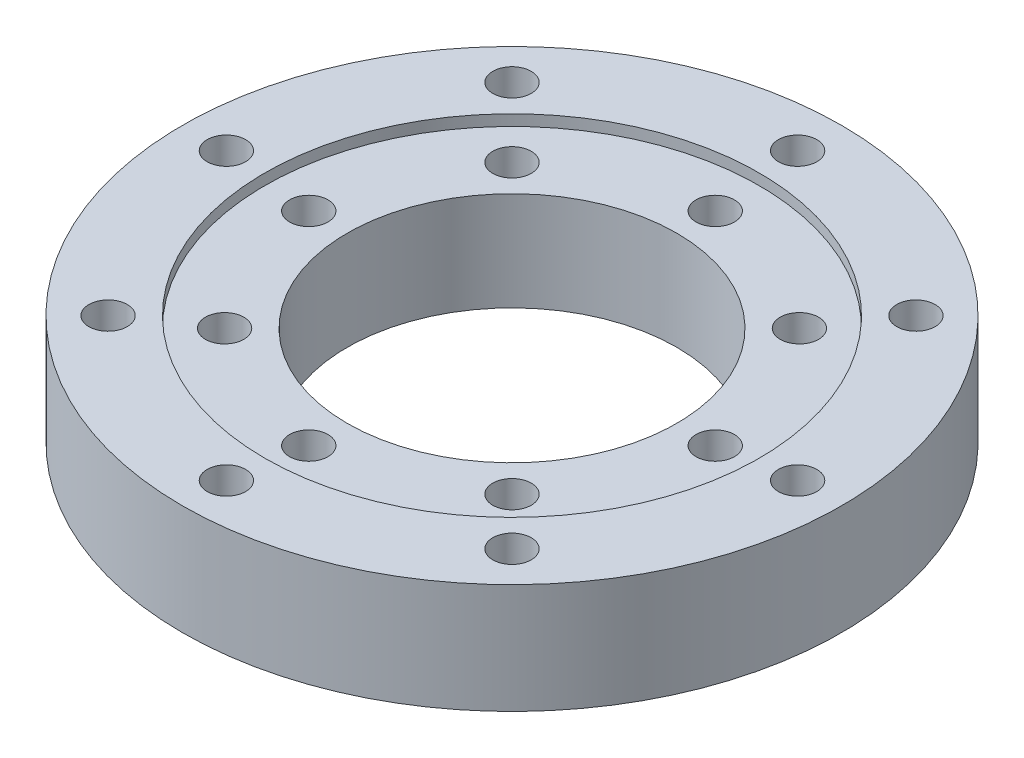
ISO-10303-21;
HEADER;
FILE_DESCRIPTION(('STEP AP214'),'2;1');
FILE_NAME('part.step','',(''),(''),'','','');
FILE_SCHEMA(('AUTOMOTIVE_DESIGN { 1 0 10303 214 1 1 1 1 }'));
ENDSEC;
DATA;
#1=APPLICATION_CONTEXT('core data for automotive mechanical design processes');
#2=APPLICATION_PROTOCOL_DEFINITION('international standard','automotive_design',2000,#1);
#3=PRODUCT_CONTEXT('',#1,'mechanical');
#4=PRODUCT('Part','Part','',(#3));
#5=PRODUCT_RELATED_PRODUCT_CATEGORY('part','',(#4));
#6=PRODUCT_DEFINITION_FORMATION('','',#4);
#7=PRODUCT_DEFINITION_CONTEXT('part definition',#1,'design');
#8=PRODUCT_DEFINITION('design','',#6,#7);
#9=PRODUCT_DEFINITION_SHAPE('','',#8);
#10=(LENGTH_UNIT() NAMED_UNIT(*) SI_UNIT(.MILLI.,.METRE.));
#11=(NAMED_UNIT(*) PLANE_ANGLE_UNIT() SI_UNIT($,.RADIAN.));
#12=(NAMED_UNIT(*) SI_UNIT($,.STERADIAN.) SOLID_ANGLE_UNIT());
#13=UNCERTAINTY_MEASURE_WITH_UNIT(LENGTH_MEASURE(1.E-05),#10,'distance_accuracy_value','');
#14=(GEOMETRIC_REPRESENTATION_CONTEXT(3) GLOBAL_UNCERTAINTY_ASSIGNED_CONTEXT((#13)) GLOBAL_UNIT_ASSIGNED_CONTEXT((#10,
#11,#12)) REPRESENTATION_CONTEXT('',''));
#15=CARTESIAN_POINT('',(0.,0.,0.));
#16=DIRECTION('',(0.,0.,1.));
#17=DIRECTION('',(1.,0.,0.));
#18=AXIS2_PLACEMENT_3D('',#15,#16,#17);
#19=CARTESIAN_POINT('',(0.,0.,0.));
#20=DIRECTION('',(0.,1.,0.));
#21=DIRECTION('',(0.,0.,1.));
#22=AXIS2_PLACEMENT_3D('',#19,#20,#21);
#23=CYLINDRICAL_SURFACE('',#22,15.);
#24=CARTESIAN_POINT('',(0.,0.,0.));
#25=DIRECTION('',(0.,1.,0.));
#26=DIRECTION('',(0.,0.,1.));
#27=AXIS2_PLACEMENT_3D('',#24,#25,#26);
#28=CIRCLE('',#27,15.);
#29=CARTESIAN_POINT('',(0.,0.,15.));
#30=VERTEX_POINT('',#29);
#31=EDGE_CURVE('E58',#30,#30,#28,.T.);
#32=ORIENTED_EDGE('',*,*,#31,.F.);
#33=EDGE_LOOP('',(#32));
#34=FACE_BOUND('',#33,.T.);
#35=CARTESIAN_POINT('',(0.,9.,0.));
#36=DIRECTION('',(0.,1.,0.));
#37=DIRECTION('',(0.,0.,1.));
#38=AXIS2_PLACEMENT_3D('',#35,#36,#37);
#39=CIRCLE('',#38,15.);
#40=CARTESIAN_POINT('',(0.,9.,15.));
#41=VERTEX_POINT('',#40);
#42=EDGE_CURVE('E47',#41,#41,#39,.F.);
#43=ORIENTED_EDGE('',*,*,#42,.F.);
#44=EDGE_LOOP('',(#43));
#45=FACE_BOUND('',#44,.T.);
#46=ADVANCED_FACE('F43',(#34,#45),#23,.F.);
#47=CARTESIAN_POINT('',(0.,10.,0.));
#48=DIRECTION('',(0.,-1.,0.));
#49=DIRECTION('',(0.,0.,-1.));
#50=AXIS2_PLACEMENT_3D('',#47,#48,#49);
#51=CYLINDRICAL_SURFACE('',#50,30.);
#52=CARTESIAN_POINT('',(0.,10.,0.));
#53=DIRECTION('',(0.,1.,0.));
#54=DIRECTION('',(0.,0.,1.));
#55=AXIS2_PLACEMENT_3D('',#52,#53,#54);
#56=CIRCLE('',#55,30.);
#57=CARTESIAN_POINT('',(0.,10.,30.));
#58=VERTEX_POINT('',#57);
#59=EDGE_CURVE('E10',#58,#58,#56,.T.);
#60=ORIENTED_EDGE('',*,*,#59,.F.);
#61=EDGE_LOOP('',(#60));
#62=FACE_BOUND('',#61,.T.);
#63=CARTESIAN_POINT('',(0.,0.,0.));
#64=DIRECTION('',(0.,1.,0.));
#65=DIRECTION('',(0.,0.,1.));
#66=AXIS2_PLACEMENT_3D('',#63,#64,#65);
#67=CIRCLE('',#66,30.);
#68=CARTESIAN_POINT('',(0.,0.,30.));
#69=VERTEX_POINT('',#68);
#70=EDGE_CURVE('E52',#69,#69,#67,.T.);
#71=ORIENTED_EDGE('',*,*,#70,.T.);
#72=EDGE_LOOP('',(#71));
#73=FACE_BOUND('',#72,.T.);
#74=ADVANCED_FACE('F45',(#62,#73),#51,.T.);
#75=CARTESIAN_POINT('',(0.,10.,0.));
#76=DIRECTION('',(0.,1.,0.));
#77=DIRECTION('',(0.,0.,1.));
#78=AXIS2_PLACEMENT_3D('',#75,#76,#77);
#79=PLANE('',#78);
#80=CARTESIAN_POINT('',(-26.,10.,0.));
#81=DIRECTION('',(0.,1.,0.));
#82=DIRECTION('',(1.,0.,0.));
#83=AXIS2_PLACEMENT_3D('',#80,#81,#82);
#84=CIRCLE('',#83,1.75);
#85=CARTESIAN_POINT('',(-24.25,10.,0.));
#86=VERTEX_POINT('',#85);
#87=EDGE_CURVE('E177',#86,#86,#84,.T.);
#88=ORIENTED_EDGE('',*,*,#87,.F.);
#89=EDGE_LOOP('',(#88));
#90=FACE_BOUND('',#89,.T.);
#91=CARTESIAN_POINT('',(-18.3847763108501,10.,18.3847763108503));
#92=DIRECTION('',(0.,1.,0.));
#93=DIRECTION('',(0.707106781186544,0.,-0.707106781186551));
#94=AXIS2_PLACEMENT_3D('',#91,#92,#93);
#95=CIRCLE('',#94,1.75);
#96=CARTESIAN_POINT('',(-17.1473394437737,10.,17.1473394437739));
#97=VERTEX_POINT('',#96);
#98=EDGE_CURVE('E169',#97,#97,#95,.T.);
#99=ORIENTED_EDGE('',*,*,#98,.F.);
#100=EDGE_LOOP('',(#99));
#101=FACE_BOUND('',#100,.T.);
#102=CARTESIAN_POINT('',(0.,10.,26.));
#103=DIRECTION('',(0.,1.,0.));
#104=DIRECTION('',(0.,0.,-1.));
#105=AXIS2_PLACEMENT_3D('',#102,#103,#104);
#106=CIRCLE('',#105,1.75);
#107=CARTESIAN_POINT('',(0.,10.,24.25));
#108=VERTEX_POINT('',#107);
#109=EDGE_CURVE('E161',#108,#108,#106,.T.);
#110=ORIENTED_EDGE('',*,*,#109,.F.);
#111=EDGE_LOOP('',(#110));
#112=FACE_BOUND('',#111,.T.);
#113=CARTESIAN_POINT('',(18.3847763108504,10.,18.3847763108501));
#114=DIRECTION('',(0.,1.,0.));
#115=DIRECTION('',(-0.707106781186554,0.,-0.707106781186541));
#116=AXIS2_PLACEMENT_3D('',#113,#114,#115);
#117=CIRCLE('',#116,1.75);
#118=CARTESIAN_POINT('',(17.1473394437739,10.,17.1473394437736));
#119=VERTEX_POINT('',#118);
#120=EDGE_CURVE('E152',#119,#119,#117,.T.);
#121=ORIENTED_EDGE('',*,*,#120,.F.);
#122=EDGE_LOOP('',(#121));
#123=FACE_BOUND('',#122,.T.);
#124=CARTESIAN_POINT('',(26.,10.,-2.72335544429764E-13));
#125=DIRECTION('',(0.,1.,0.));
#126=DIRECTION('',(-1.,0.,0.));
#127=AXIS2_PLACEMENT_3D('',#124,#125,#126);
#128=CIRCLE('',#127,1.75);
#129=CARTESIAN_POINT('',(24.25,10.,-2.54005267400838E-13));
#130=VERTEX_POINT('',#129);
#131=EDGE_CURVE('E192',#130,#130,#128,.T.);
#132=ORIENTED_EDGE('',*,*,#131,.F.);
#133=EDGE_LOOP('',(#132));
#134=FACE_BOUND('',#133,.T.);
#135=CARTESIAN_POINT('',(18.38477631085,10.,-18.3847763108505));
#136=DIRECTION('',(0.,1.,0.));
#137=DIRECTION('',(-0.707106781186539,0.,0.707106781186556));
#138=AXIS2_PLACEMENT_3D('',#135,#136,#137);
#139=CIRCLE('',#138,1.75);
#140=CARTESIAN_POINT('',(17.1473394437736,10.,-17.147339443774));
#141=VERTEX_POINT('',#140);
#142=EDGE_CURVE('E184',#141,#141,#139,.T.);
#143=ORIENTED_EDGE('',*,*,#142,.F.);
#144=EDGE_LOOP('',(#143));
#145=FACE_BOUND('',#144,.T.);
#146=CARTESIAN_POINT('',(-18.3847763108503,10.,-18.3847763108502));
#147=DIRECTION('',(0.,1.,0.));
#148=DIRECTION('',(0.707106781186549,0.,0.707106781186546));
#149=AXIS2_PLACEMENT_3D('',#146,#147,#148);
#150=CIRCLE('',#149,1.75);
#151=CARTESIAN_POINT('',(-17.1473394437738,10.,-17.1473394437737));
#152=VERTEX_POINT('',#151);
#153=EDGE_CURVE('E144',#152,#152,#150,.T.);
#154=ORIENTED_EDGE('',*,*,#153,.F.);
#155=EDGE_LOOP('',(#154));
#156=FACE_BOUND('',#155,.T.);
#157=CARTESIAN_POINT('',(0.,10.,-26.));
#158=DIRECTION('',(0.,1.,0.));
#159=DIRECTION('',(0.,0.,1.));
#160=AXIS2_PLACEMENT_3D('',#157,#158,#159);
#161=CIRCLE('',#160,1.75);
#162=CARTESIAN_POINT('',(0.,10.,-24.25));
#163=VERTEX_POINT('',#162);
#164=EDGE_CURVE('E136',#163,#163,#161,.T.);
#165=ORIENTED_EDGE('',*,*,#164,.F.);
#166=EDGE_LOOP('',(#165));
#167=FACE_BOUND('',#166,.T.);
#168=CARTESIAN_POINT('',(0.,10.,0.));
#169=DIRECTION('',(0.,1.,0.));
#170=DIRECTION('',(0.,0.,1.));
#171=AXIS2_PLACEMENT_3D('',#168,#169,#170);
#172=CIRCLE('',#171,22.5);
#173=CARTESIAN_POINT('',(0.,10.,22.5));
#174=VERTEX_POINT('',#173);
#175=EDGE_CURVE('E63',#174,#174,#172,.T.);
#176=ORIENTED_EDGE('',*,*,#175,.F.);
#177=EDGE_LOOP('',(#176));
#178=FACE_BOUND('',#177,.T.);
#179=ORIENTED_EDGE('',*,*,#59,.T.);
#180=EDGE_LOOP('',(#179));
#181=FACE_BOUND('',#180,.T.);
#182=ADVANCED_FACE('F211',(#90,#101,#112,#123,#134,#145,#156,#167,#178,#181),#79,.T.);
#183=CARTESIAN_POINT('',(0.,0.,0.));
#184=DIRECTION('',(0.,1.,0.));
#185=DIRECTION('',(0.,0.,1.));
#186=AXIS2_PLACEMENT_3D('',#183,#184,#185);
#187=PLANE('',#186);
#188=CARTESIAN_POINT('',(-26.,0.,0.));
#189=DIRECTION('',(0.,1.,0.));
#190=DIRECTION('',(1.,0.,0.));
#191=AXIS2_PLACEMENT_3D('',#188,#189,#190);
#192=CIRCLE('',#191,1.75);
#193=CARTESIAN_POINT('',(-24.25,0.,0.));
#194=VERTEX_POINT('',#193);
#195=EDGE_CURVE('E148',#194,#194,#192,.T.);
#196=ORIENTED_EDGE('',*,*,#195,.T.);
#197=EDGE_LOOP('',(#196));
#198=FACE_BOUND('',#197,.T.);
#199=CARTESIAN_POINT('',(-18.3847763108501,0.,18.3847763108503));
#200=DIRECTION('',(0.,1.,0.));
#201=DIRECTION('',(0.707106781186544,0.,-0.707106781186551));
#202=AXIS2_PLACEMENT_3D('',#199,#200,#201);
#203=CIRCLE('',#202,1.75);
#204=CARTESIAN_POINT('',(-17.1473394437737,0.,17.1473394437739));
#205=VERTEX_POINT('',#204);
#206=EDGE_CURVE('E173',#205,#205,#203,.T.);
#207=ORIENTED_EDGE('',*,*,#206,.T.);
#208=EDGE_LOOP('',(#207));
#209=FACE_BOUND('',#208,.T.);
#210=CARTESIAN_POINT('',(0.,0.,26.));
#211=DIRECTION('',(0.,1.,0.));
#212=DIRECTION('',(0.,0.,-1.));
#213=AXIS2_PLACEMENT_3D('',#210,#211,#212);
#214=CIRCLE('',#213,1.75);
#215=CARTESIAN_POINT('',(0.,0.,24.25));
#216=VERTEX_POINT('',#215);
#217=EDGE_CURVE('E165',#216,#216,#214,.T.);
#218=ORIENTED_EDGE('',*,*,#217,.T.);
#219=EDGE_LOOP('',(#218));
#220=FACE_BOUND('',#219,.T.);
#221=CARTESIAN_POINT('',(18.3847763108504,0.,18.3847763108501));
#222=DIRECTION('',(0.,1.,0.));
#223=DIRECTION('',(-0.707106781186554,0.,-0.707106781186541));
#224=AXIS2_PLACEMENT_3D('',#221,#222,#223);
#225=CIRCLE('',#224,1.75);
#226=CARTESIAN_POINT('',(17.1473394437739,0.,17.1473394437736));
#227=VERTEX_POINT('',#226);
#228=EDGE_CURVE('E156',#227,#227,#225,.T.);
#229=ORIENTED_EDGE('',*,*,#228,.T.);
#230=EDGE_LOOP('',(#229));
#231=FACE_BOUND('',#230,.T.);
#232=CARTESIAN_POINT('',(26.,0.,-2.72335544429764E-13));
#233=DIRECTION('',(0.,1.,0.));
#234=DIRECTION('',(-1.,0.,0.));
#235=AXIS2_PLACEMENT_3D('',#232,#233,#234);
#236=CIRCLE('',#235,1.75);
#237=CARTESIAN_POINT('',(24.25,0.,-2.54005267400838E-13));
#238=VERTEX_POINT('',#237);
#239=EDGE_CURVE('E157',#238,#238,#236,.T.);
#240=ORIENTED_EDGE('',*,*,#239,.T.);
#241=EDGE_LOOP('',(#240));
#242=FACE_BOUND('',#241,.T.);
#243=CARTESIAN_POINT('',(18.38477631085,0.,-18.3847763108505));
#244=DIRECTION('',(0.,1.,0.));
#245=DIRECTION('',(-0.707106781186539,0.,0.707106781186556));
#246=AXIS2_PLACEMENT_3D('',#243,#244,#245);
#247=CIRCLE('',#246,1.75);
#248=CARTESIAN_POINT('',(17.1473394437736,0.,-17.147339443774));
#249=VERTEX_POINT('',#248);
#250=EDGE_CURVE('E188',#249,#249,#247,.T.);
#251=ORIENTED_EDGE('',*,*,#250,.T.);
#252=EDGE_LOOP('',(#251));
#253=FACE_BOUND('',#252,.T.);
#254=CARTESIAN_POINT('',(-18.3847763108503,0.,-18.3847763108502));
#255=DIRECTION('',(0.,1.,0.));
#256=DIRECTION('',(0.707106781186549,0.,0.707106781186546));
#257=AXIS2_PLACEMENT_3D('',#254,#255,#256);
#258=CIRCLE('',#257,1.75);
#259=CARTESIAN_POINT('',(-17.1473394437738,0.,-17.1473394437737));
#260=VERTEX_POINT('',#259);
#261=EDGE_CURVE('E140',#260,#260,#258,.T.);
#262=ORIENTED_EDGE('',*,*,#261,.T.);
#263=EDGE_LOOP('',(#262));
#264=FACE_BOUND('',#263,.T.);
#265=CARTESIAN_POINT('',(0.,0.,-26.));
#266=DIRECTION('',(0.,1.,0.));
#267=DIRECTION('',(0.,0.,1.));
#268=AXIS2_PLACEMENT_3D('',#265,#266,#267);
#269=CIRCLE('',#268,1.75);
#270=CARTESIAN_POINT('',(0.,0.,-24.25));
#271=VERTEX_POINT('',#270);
#272=EDGE_CURVE('E125',#271,#271,#269,.T.);
#273=ORIENTED_EDGE('',*,*,#272,.T.);
#274=EDGE_LOOP('',(#273));
#275=FACE_BOUND('',#274,.T.);
#276=CARTESIAN_POINT('',(-18.5,0.,0.));
#277=DIRECTION('',(0.,1.,0.));
#278=DIRECTION('',(1.,0.,0.));
#279=AXIS2_PLACEMENT_3D('',#276,#277,#278);
#280=CIRCLE('',#279,1.75);
#281=CARTESIAN_POINT('',(-16.75,0.,0.));
#282=VERTEX_POINT('',#281);
#283=EDGE_CURVE('E84',#282,#282,#280,.T.);
#284=ORIENTED_EDGE('',*,*,#283,.T.);
#285=EDGE_LOOP('',(#284));
#286=FACE_BOUND('',#285,.T.);
#287=CARTESIAN_POINT('',(-13.0814754519511,0.,13.0814754519512));
#288=DIRECTION('',(0.,1.,0.));
#289=DIRECTION('',(0.707106781186544,0.,-0.707106781186551));
#290=AXIS2_PLACEMENT_3D('',#287,#288,#289);
#291=CIRCLE('',#290,1.75);
#292=CARTESIAN_POINT('',(-11.8440385848746,0.,11.8440385848747));
#293=VERTEX_POINT('',#292);
#294=EDGE_CURVE('E109',#293,#293,#291,.T.);
#295=ORIENTED_EDGE('',*,*,#294,.T.);
#296=EDGE_LOOP('',(#295));
#297=FACE_BOUND('',#296,.T.);
#298=CARTESIAN_POINT('',(0.,0.,18.5));
#299=DIRECTION('',(0.,1.,0.));
#300=DIRECTION('',(0.,0.,-1.));
#301=AXIS2_PLACEMENT_3D('',#298,#299,#300);
#302=CIRCLE('',#301,1.75);
#303=CARTESIAN_POINT('',(0.,0.,16.75));
#304=VERTEX_POINT('',#303);
#305=EDGE_CURVE('E101',#304,#304,#302,.T.);
#306=ORIENTED_EDGE('',*,*,#305,.T.);
#307=EDGE_LOOP('',(#306));
#308=FACE_BOUND('',#307,.T.);
#309=CARTESIAN_POINT('',(13.0814754519512,0.,13.081475451951));
#310=DIRECTION('',(0.,1.,0.));
#311=DIRECTION('',(-0.707106781186554,0.,-0.707106781186541));
#312=AXIS2_PLACEMENT_3D('',#309,#310,#311);
#313=CIRCLE('',#312,1.75);
#314=CARTESIAN_POINT('',(11.8440385848748,0.,11.8440385848746));
#315=VERTEX_POINT('',#314);
#316=EDGE_CURVE('E92',#315,#315,#313,.T.);
#317=ORIENTED_EDGE('',*,*,#316,.T.);
#318=EDGE_LOOP('',(#317));
#319=FACE_BOUND('',#318,.T.);
#320=CARTESIAN_POINT('',(18.5,0.,-1.93777214305794E-13));
#321=DIRECTION('',(0.,1.,0.));
#322=DIRECTION('',(-1.,0.,0.));
#323=AXIS2_PLACEMENT_3D('',#320,#321,#322);
#324=CIRCLE('',#323,1.75);
#325=CARTESIAN_POINT('',(16.75,0.,-1.75446937276867E-13));
#326=VERTEX_POINT('',#325);
#327=EDGE_CURVE('E93',#326,#326,#324,.T.);
#328=ORIENTED_EDGE('',*,*,#327,.T.);
#329=EDGE_LOOP('',(#328));
#330=FACE_BOUND('',#329,.T.);
#331=CARTESIAN_POINT('',(13.081475451951,0.,-13.0814754519513));
#332=DIRECTION('',(0.,1.,0.));
#333=DIRECTION('',(-0.707106781186539,0.,0.707106781186556));
#334=AXIS2_PLACEMENT_3D('',#331,#332,#333);
#335=CIRCLE('',#334,1.75);
#336=CARTESIAN_POINT('',(11.8440385848745,0.,-11.8440385848748));
#337=VERTEX_POINT('',#336);
#338=EDGE_CURVE('E124',#337,#337,#335,.T.);
#339=ORIENTED_EDGE('',*,*,#338,.T.);
#340=EDGE_LOOP('',(#339));
#341=FACE_BOUND('',#340,.T.);
#342=CARTESIAN_POINT('',(-13.0814754519512,0.,-13.0814754519511));
#343=DIRECTION('',(0.,1.,0.));
#344=DIRECTION('',(0.707106781186549,0.,0.707106781186546));
#345=AXIS2_PLACEMENT_3D('',#342,#343,#344);
#346=CIRCLE('',#345,1.75);
#347=CARTESIAN_POINT('',(-11.8440385848747,0.,-11.8440385848746));
#348=VERTEX_POINT('',#347);
#349=EDGE_CURVE('E76',#348,#348,#346,.T.);
#350=ORIENTED_EDGE('',*,*,#349,.T.);
#351=EDGE_LOOP('',(#350));
#352=FACE_BOUND('',#351,.T.);
#353=CARTESIAN_POINT('',(0.,0.,-18.5));
#354=DIRECTION('',(0.,1.,0.));
#355=DIRECTION('',(0.,0.,1.));
#356=AXIS2_PLACEMENT_3D('',#353,#354,#355);
#357=CIRCLE('',#356,1.75);
#358=CARTESIAN_POINT('',(0.,0.,-16.75));
#359=VERTEX_POINT('',#358);
#360=EDGE_CURVE('E68',#359,#359,#357,.T.);
#361=ORIENTED_EDGE('',*,*,#360,.T.);
#362=EDGE_LOOP('',(#361));
#363=FACE_BOUND('',#362,.T.);
#364=ORIENTED_EDGE('',*,*,#31,.T.);
#365=EDGE_LOOP('',(#364));
#366=FACE_BOUND('',#365,.T.);
#367=ORIENTED_EDGE('',*,*,#70,.F.);
#368=EDGE_LOOP('',(#367));
#369=FACE_BOUND('',#368,.T.);
#370=ADVANCED_FACE('F200',(#198,#209,#220,#231,#242,#253,#264,#275,#286,#297,#308,#319,#330,
#341,#352,#363,#366,#369),#187,.F.);
#371=CARTESIAN_POINT('',(0.,9.,0.));
#372=DIRECTION('',(0.,1.,0.));
#373=DIRECTION('',(0.,0.,1.));
#374=AXIS2_PLACEMENT_3D('',#371,#372,#373);
#375=PLANE('',#374);
#376=CARTESIAN_POINT('',(-18.5,9.,0.));
#377=DIRECTION('',(0.,1.,0.));
#378=DIRECTION('',(1.,0.,0.));
#379=AXIS2_PLACEMENT_3D('',#376,#377,#378);
#380=CIRCLE('',#379,1.75);
#381=CARTESIAN_POINT('',(-16.75,9.,0.));
#382=VERTEX_POINT('',#381);
#383=EDGE_CURVE('E113',#382,#382,#380,.T.);
#384=ORIENTED_EDGE('',*,*,#383,.F.);
#385=EDGE_LOOP('',(#384));
#386=FACE_BOUND('',#385,.T.);
#387=CARTESIAN_POINT('',(-13.0814754519511,9.,13.0814754519512));
#388=DIRECTION('',(0.,1.,0.));
#389=DIRECTION('',(0.707106781186544,0.,-0.707106781186551));
#390=AXIS2_PLACEMENT_3D('',#387,#388,#389);
#391=CIRCLE('',#390,1.75);
#392=CARTESIAN_POINT('',(-11.8440385848746,9.,11.8440385848747));
#393=VERTEX_POINT('',#392);
#394=EDGE_CURVE('E105',#393,#393,#391,.T.);
#395=ORIENTED_EDGE('',*,*,#394,.F.);
#396=EDGE_LOOP('',(#395));
#397=FACE_BOUND('',#396,.T.);
#398=CARTESIAN_POINT('',(0.,9.,18.5));
#399=DIRECTION('',(0.,1.,0.));
#400=DIRECTION('',(0.,0.,-1.));
#401=AXIS2_PLACEMENT_3D('',#398,#399,#400);
#402=CIRCLE('',#401,1.75);
#403=CARTESIAN_POINT('',(0.,9.,16.75));
#404=VERTEX_POINT('',#403);
#405=EDGE_CURVE('E97',#404,#404,#402,.T.);
#406=ORIENTED_EDGE('',*,*,#405,.F.);
#407=EDGE_LOOP('',(#406));
#408=FACE_BOUND('',#407,.T.);
#409=CARTESIAN_POINT('',(13.0814754519512,9.,13.081475451951));
#410=DIRECTION('',(0.,1.,0.));
#411=DIRECTION('',(-0.707106781186554,0.,-0.707106781186541));
#412=AXIS2_PLACEMENT_3D('',#409,#410,#411);
#413=CIRCLE('',#412,1.75);
#414=CARTESIAN_POINT('',(11.8440385848748,9.,11.8440385848746));
#415=VERTEX_POINT('',#414);
#416=EDGE_CURVE('E88',#415,#415,#413,.T.);
#417=ORIENTED_EDGE('',*,*,#416,.F.);
#418=EDGE_LOOP('',(#417));
#419=FACE_BOUND('',#418,.T.);
#420=CARTESIAN_POINT('',(18.5,9.,-1.93777214305794E-13));
#421=DIRECTION('',(0.,1.,0.));
#422=DIRECTION('',(-1.,0.,0.));
#423=AXIS2_PLACEMENT_3D('',#420,#421,#422);
#424=CIRCLE('',#423,1.75);
#425=CARTESIAN_POINT('',(16.75,9.,-1.75446937276867E-13));
#426=VERTEX_POINT('',#425);
#427=EDGE_CURVE('E129',#426,#426,#424,.T.);
#428=ORIENTED_EDGE('',*,*,#427,.F.);
#429=EDGE_LOOP('',(#428));
#430=FACE_BOUND('',#429,.T.);
#431=CARTESIAN_POINT('',(13.081475451951,9.,-13.0814754519513));
#432=DIRECTION('',(0.,1.,0.));
#433=DIRECTION('',(-0.707106781186539,0.,0.707106781186556));
#434=AXIS2_PLACEMENT_3D('',#431,#432,#433);
#435=CIRCLE('',#434,1.75);
#436=CARTESIAN_POINT('',(11.8440385848745,9.,-11.8440385848748));
#437=VERTEX_POINT('',#436);
#438=EDGE_CURVE('E120',#437,#437,#435,.T.);
#439=ORIENTED_EDGE('',*,*,#438,.F.);
#440=EDGE_LOOP('',(#439));
#441=FACE_BOUND('',#440,.T.);
#442=CARTESIAN_POINT('',(-13.0814754519512,9.,-13.0814754519511));
#443=DIRECTION('',(0.,1.,0.));
#444=DIRECTION('',(0.707106781186549,0.,0.707106781186546));
#445=AXIS2_PLACEMENT_3D('',#442,#443,#444);
#446=CIRCLE('',#445,1.75);
#447=CARTESIAN_POINT('',(-11.8440385848747,9.,-11.8440385848746));
#448=VERTEX_POINT('',#447);
#449=EDGE_CURVE('E80',#448,#448,#446,.T.);
#450=ORIENTED_EDGE('',*,*,#449,.F.);
#451=EDGE_LOOP('',(#450));
#452=FACE_BOUND('',#451,.T.);
#453=CARTESIAN_POINT('',(0.,9.,-18.5));
#454=DIRECTION('',(0.,1.,0.));
#455=DIRECTION('',(0.,0.,1.));
#456=AXIS2_PLACEMENT_3D('',#453,#454,#455);
#457=CIRCLE('',#456,1.75);
#458=CARTESIAN_POINT('',(0.,9.,-16.75));
#459=VERTEX_POINT('',#458);
#460=EDGE_CURVE('E72',#459,#459,#457,.T.);
#461=ORIENTED_EDGE('',*,*,#460,.F.);
#462=EDGE_LOOP('',(#461));
#463=FACE_BOUND('',#462,.T.);
#464=CARTESIAN_POINT('',(0.,9.,0.));
#465=DIRECTION('',(0.,1.,0.));
#466=DIRECTION('',(0.,0.,1.));
#467=AXIS2_PLACEMENT_3D('',#464,#465,#466);
#468=CIRCLE('',#467,22.5);
#469=CARTESIAN_POINT('',(0.,9.,22.5));
#470=VERTEX_POINT('',#469);
#471=EDGE_CURVE('E67',#470,#470,#468,.T.);
#472=ORIENTED_EDGE('',*,*,#471,.T.);
#473=EDGE_LOOP('',(#472));
#474=FACE_BOUND('',#473,.T.);
#475=ORIENTED_EDGE('',*,*,#42,.T.);
#476=EDGE_LOOP('',(#475));
#477=FACE_BOUND('',#476,.T.);
#478=ADVANCED_FACE('F227',(#386,#397,#408,#419,#430,#441,#452,#463,#474,#477),#375,.T.);
#479=CARTESIAN_POINT('',(0.,9.,0.));
#480=DIRECTION('',(0.,1.,0.));
#481=DIRECTION('',(0.,0.,1.));
#482=AXIS2_PLACEMENT_3D('',#479,#480,#481);
#483=CYLINDRICAL_SURFACE('',#482,22.5);
#484=ORIENTED_EDGE('',*,*,#471,.F.);
#485=EDGE_LOOP('',(#484));
#486=FACE_BOUND('',#485,.T.);
#487=ORIENTED_EDGE('',*,*,#175,.T.);
#488=EDGE_LOOP('',(#487));
#489=FACE_BOUND('',#488,.T.);
#490=ADVANCED_FACE('F224',(#486,#489),#483,.F.);
#491=CARTESIAN_POINT('',(0.,0.,-18.5));
#492=DIRECTION('',(0.,1.,0.));
#493=DIRECTION('',(0.,0.,1.));
#494=AXIS2_PLACEMENT_3D('',#491,#492,#493);
#495=CYLINDRICAL_SURFACE('',#494,1.75);
#496=ORIENTED_EDGE('',*,*,#360,.F.);
#497=EDGE_LOOP('',(#496));
#498=FACE_BOUND('',#497,.T.);
#499=ORIENTED_EDGE('',*,*,#460,.T.);
#500=EDGE_LOOP('',(#499));
#501=FACE_BOUND('',#500,.T.);
#502=ADVANCED_FACE('F226',(#498,#501),#495,.F.);
#503=CARTESIAN_POINT('',(-13.0814754519512,0.,-13.0814754519511));
#504=DIRECTION('',(0.,1.,0.));
#505=DIRECTION('',(0.,0.,1.));
#506=AXIS2_PLACEMENT_3D('',#503,#504,#505);
#507=CYLINDRICAL_SURFACE('',#506,1.75);
#508=ORIENTED_EDGE('',*,*,#349,.F.);
#509=EDGE_LOOP('',(#508));
#510=FACE_BOUND('',#509,.T.);
#511=ORIENTED_EDGE('',*,*,#449,.T.);
#512=EDGE_LOOP('',(#511));
#513=FACE_BOUND('',#512,.T.);
#514=ADVANCED_FACE('F234',(#510,#513),#507,.F.);
#515=CARTESIAN_POINT('',(13.081475451951,0.,-13.0814754519513));
#516=DIRECTION('',(0.,1.,0.));
#517=DIRECTION('',(0.,0.,1.));
#518=AXIS2_PLACEMENT_3D('',#515,#516,#517);
#519=CYLINDRICAL_SURFACE('',#518,1.75);
#520=ORIENTED_EDGE('',*,*,#338,.F.);
#521=EDGE_LOOP('',(#520));
#522=FACE_BOUND('',#521,.T.);
#523=ORIENTED_EDGE('',*,*,#438,.T.);
#524=EDGE_LOOP('',(#523));
#525=FACE_BOUND('',#524,.T.);
#526=ADVANCED_FACE('F288',(#522,#525),#519,.F.);
#527=CARTESIAN_POINT('',(18.5,0.,-1.93777214305794E-13));
#528=DIRECTION('',(0.,1.,0.));
#529=DIRECTION('',(0.,0.,1.));
#530=AXIS2_PLACEMENT_3D('',#527,#528,#529);
#531=CYLINDRICAL_SURFACE('',#530,1.75);
#532=ORIENTED_EDGE('',*,*,#327,.F.);
#533=EDGE_LOOP('',(#532));
#534=FACE_BOUND('',#533,.T.);
#535=ORIENTED_EDGE('',*,*,#427,.T.);
#536=EDGE_LOOP('',(#535));
#537=FACE_BOUND('',#536,.T.);
#538=ADVANCED_FACE('F284',(#534,#537),#531,.F.);
#539=CARTESIAN_POINT('',(13.0814754519512,0.,13.081475451951));
#540=DIRECTION('',(0.,1.,0.));
#541=DIRECTION('',(0.,0.,1.));
#542=AXIS2_PLACEMENT_3D('',#539,#540,#541);
#543=CYLINDRICAL_SURFACE('',#542,1.75);
#544=ORIENTED_EDGE('',*,*,#316,.F.);
#545=EDGE_LOOP('',(#544));
#546=FACE_BOUND('',#545,.T.);
#547=ORIENTED_EDGE('',*,*,#416,.T.);
#548=EDGE_LOOP('',(#547));
#549=FACE_BOUND('',#548,.T.);
#550=ADVANCED_FACE('F287',(#546,#549),#543,.F.);
#551=CARTESIAN_POINT('',(0.,0.,18.5));
#552=DIRECTION('',(0.,1.,0.));
#553=DIRECTION('',(0.,0.,1.));
#554=AXIS2_PLACEMENT_3D('',#551,#552,#553);
#555=CYLINDRICAL_SURFACE('',#554,1.75);
#556=ORIENTED_EDGE('',*,*,#305,.F.);
#557=EDGE_LOOP('',(#556));
#558=FACE_BOUND('',#557,.T.);
#559=ORIENTED_EDGE('',*,*,#405,.T.);
#560=EDGE_LOOP('',(#559));
#561=FACE_BOUND('',#560,.T.);
#562=ADVANCED_FACE('F299',(#558,#561),#555,.F.);
#563=CARTESIAN_POINT('',(-13.0814754519511,0.,13.0814754519512));
#564=DIRECTION('',(0.,1.,0.));
#565=DIRECTION('',(0.,0.,1.));
#566=AXIS2_PLACEMENT_3D('',#563,#564,#565);
#567=CYLINDRICAL_SURFACE('',#566,1.75);
#568=ORIENTED_EDGE('',*,*,#294,.F.);
#569=EDGE_LOOP('',(#568));
#570=FACE_BOUND('',#569,.T.);
#571=ORIENTED_EDGE('',*,*,#394,.T.);
#572=EDGE_LOOP('',(#571));
#573=FACE_BOUND('',#572,.T.);
#574=ADVANCED_FACE('F295',(#570,#573),#567,.F.);
#575=CARTESIAN_POINT('',(-18.5,0.,0.));
#576=DIRECTION('',(0.,1.,0.));
#577=DIRECTION('',(0.,0.,1.));
#578=AXIS2_PLACEMENT_3D('',#575,#576,#577);
#579=CYLINDRICAL_SURFACE('',#578,1.75);
#580=ORIENTED_EDGE('',*,*,#283,.F.);
#581=EDGE_LOOP('',(#580));
#582=FACE_BOUND('',#581,.T.);
#583=ORIENTED_EDGE('',*,*,#383,.T.);
#584=EDGE_LOOP('',(#583));
#585=FACE_BOUND('',#584,.T.);
#586=ADVANCED_FACE('F282',(#582,#585),#579,.F.);
#587=CARTESIAN_POINT('',(0.,0.,-26.));
#588=DIRECTION('',(0.,1.,0.));
#589=DIRECTION('',(0.,0.,1.));
#590=AXIS2_PLACEMENT_3D('',#587,#588,#589);
#591=CYLINDRICAL_SURFACE('',#590,1.75);
#592=ORIENTED_EDGE('',*,*,#272,.F.);
#593=EDGE_LOOP('',(#592));
#594=FACE_BOUND('',#593,.T.);
#595=ORIENTED_EDGE('',*,*,#164,.T.);
#596=EDGE_LOOP('',(#595));
#597=FACE_BOUND('',#596,.T.);
#598=ADVANCED_FACE('F278',(#594,#597),#591,.F.);
#599=CARTESIAN_POINT('',(-18.3847763108503,0.,-18.3847763108502));
#600=DIRECTION('',(0.,1.,0.));
#601=DIRECTION('',(0.,0.,1.));
#602=AXIS2_PLACEMENT_3D('',#599,#600,#601);
#603=CYLINDRICAL_SURFACE('',#602,1.75);
#604=ORIENTED_EDGE('',*,*,#261,.F.);
#605=EDGE_LOOP('',(#604));
#606=FACE_BOUND('',#605,.T.);
#607=ORIENTED_EDGE('',*,*,#153,.T.);
#608=EDGE_LOOP('',(#607));
#609=FACE_BOUND('',#608,.T.);
#610=ADVANCED_FACE('F276',(#606,#609),#603,.F.);
#611=CARTESIAN_POINT('',(18.38477631085,0.,-18.3847763108505));
#612=DIRECTION('',(0.,1.,0.));
#613=DIRECTION('',(0.,0.,1.));
#614=AXIS2_PLACEMENT_3D('',#611,#612,#613);
#615=CYLINDRICAL_SURFACE('',#614,1.75);
#616=ORIENTED_EDGE('',*,*,#250,.F.);
#617=EDGE_LOOP('',(#616));
#618=FACE_BOUND('',#617,.T.);
#619=ORIENTED_EDGE('',*,*,#142,.T.);
#620=EDGE_LOOP('',(#619));
#621=FACE_BOUND('',#620,.T.);
#622=ADVANCED_FACE('F207',(#618,#621),#615,.F.);
#623=CARTESIAN_POINT('',(26.,0.,-2.72335544429764E-13));
#624=DIRECTION('',(0.,1.,0.));
#625=DIRECTION('',(0.,0.,1.));
#626=AXIS2_PLACEMENT_3D('',#623,#624,#625);
#627=CYLINDRICAL_SURFACE('',#626,1.75);
#628=ORIENTED_EDGE('',*,*,#239,.F.);
#629=EDGE_LOOP('',(#628));
#630=FACE_BOUND('',#629,.T.);
#631=ORIENTED_EDGE('',*,*,#131,.T.);
#632=EDGE_LOOP('',(#631));
#633=FACE_BOUND('',#632,.T.);
#634=ADVANCED_FACE('F203',(#630,#633),#627,.F.);
#635=CARTESIAN_POINT('',(18.3847763108504,0.,18.3847763108501));
#636=DIRECTION('',(0.,1.,0.));
#637=DIRECTION('',(0.,0.,1.));
#638=AXIS2_PLACEMENT_3D('',#635,#636,#637);
#639=CYLINDRICAL_SURFACE('',#638,1.75);
#640=ORIENTED_EDGE('',*,*,#228,.F.);
#641=EDGE_LOOP('',(#640));
#642=FACE_BOUND('',#641,.T.);
#643=ORIENTED_EDGE('',*,*,#120,.T.);
#644=EDGE_LOOP('',(#643));
#645=FACE_BOUND('',#644,.T.);
#646=ADVANCED_FACE('F206',(#642,#645),#639,.F.);
#647=CARTESIAN_POINT('',(0.,0.,26.));
#648=DIRECTION('',(0.,1.,0.));
#649=DIRECTION('',(0.,0.,1.));
#650=AXIS2_PLACEMENT_3D('',#647,#648,#649);
#651=CYLINDRICAL_SURFACE('',#650,1.75);
#652=ORIENTED_EDGE('',*,*,#217,.F.);
#653=EDGE_LOOP('',(#652));
#654=FACE_BOUND('',#653,.T.);
#655=ORIENTED_EDGE('',*,*,#109,.T.);
#656=EDGE_LOOP('',(#655));
#657=FACE_BOUND('',#656,.T.);
#658=ADVANCED_FACE('F264',(#654,#657),#651,.F.);
#659=CARTESIAN_POINT('',(-18.3847763108501,0.,18.3847763108503));
#660=DIRECTION('',(0.,1.,0.));
#661=DIRECTION('',(0.,0.,1.));
#662=AXIS2_PLACEMENT_3D('',#659,#660,#661);
#663=CYLINDRICAL_SURFACE('',#662,1.75);
#664=ORIENTED_EDGE('',*,*,#206,.F.);
#665=EDGE_LOOP('',(#664));
#666=FACE_BOUND('',#665,.T.);
#667=ORIENTED_EDGE('',*,*,#98,.T.);
#668=EDGE_LOOP('',(#667));
#669=FACE_BOUND('',#668,.T.);
#670=ADVANCED_FACE('F271',(#666,#669),#663,.F.);
#671=CARTESIAN_POINT('',(-26.,0.,0.));
#672=DIRECTION('',(0.,1.,0.));
#673=DIRECTION('',(0.,0.,1.));
#674=AXIS2_PLACEMENT_3D('',#671,#672,#673);
#675=CYLINDRICAL_SURFACE('',#674,1.75);
#676=ORIENTED_EDGE('',*,*,#195,.F.);
#677=EDGE_LOOP('',(#676));
#678=FACE_BOUND('',#677,.T.);
#679=ORIENTED_EDGE('',*,*,#87,.T.);
#680=EDGE_LOOP('',(#679));
#681=FACE_BOUND('',#680,.T.);
#682=ADVANCED_FACE('F442',(#678,#681),#675,.F.);
#683=CLOSED_SHELL('',(#46,#74,#182,#370,#478,#490,#502,#514,#526,#538,#550,#562,#574,#586,#598,
#610,#622,#634,#646,#658,#670,#682));
#684=MANIFOLD_SOLID_BREP('B2',#683);
#685=ADVANCED_BREP_SHAPE_REPRESENTATION('',(#18,#684),#14);
#686=SHAPE_DEFINITION_REPRESENTATION(#9,#685);
ENDSEC;
END-ISO-10303-21;
